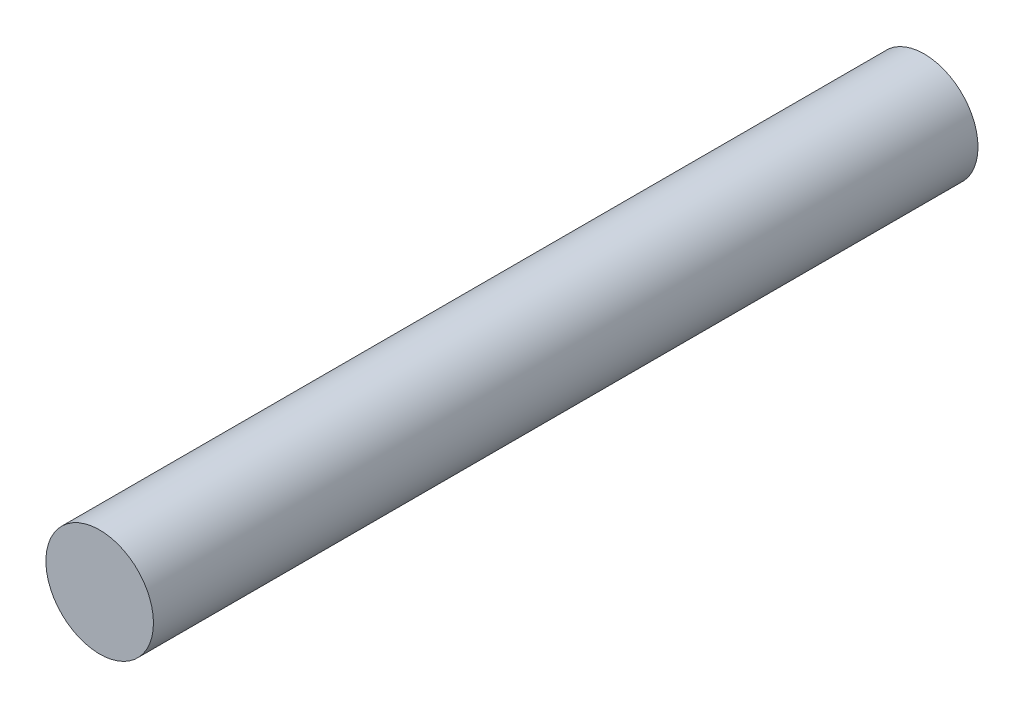
ISO-10303-21;
HEADER;
FILE_DESCRIPTION(('STEP AP214'),'2;1');
FILE_NAME('part.step','',(''),(''),'','','');
FILE_SCHEMA(('AUTOMOTIVE_DESIGN { 1 0 10303 214 1 1 1 1 }'));
ENDSEC;
DATA;
#1=APPLICATION_CONTEXT('core data for automotive mechanical design processes');
#2=APPLICATION_PROTOCOL_DEFINITION('international standard','automotive_design',2000,#1);
#3=PRODUCT_CONTEXT('',#1,'mechanical');
#4=PRODUCT('Part','Part','',(#3));
#5=PRODUCT_RELATED_PRODUCT_CATEGORY('part','',(#4));
#6=PRODUCT_DEFINITION_FORMATION('','',#4);
#7=PRODUCT_DEFINITION_CONTEXT('part definition',#1,'design');
#8=PRODUCT_DEFINITION('design','',#6,#7);
#9=PRODUCT_DEFINITION_SHAPE('','',#8);
#10=(LENGTH_UNIT() NAMED_UNIT(*) SI_UNIT(.MILLI.,.METRE.));
#11=(NAMED_UNIT(*) PLANE_ANGLE_UNIT() SI_UNIT($,.RADIAN.));
#12=(NAMED_UNIT(*) SI_UNIT($,.STERADIAN.) SOLID_ANGLE_UNIT());
#13=UNCERTAINTY_MEASURE_WITH_UNIT(LENGTH_MEASURE(1.E-05),#10,'distance_accuracy_value','');
#14=(GEOMETRIC_REPRESENTATION_CONTEXT(3) GLOBAL_UNCERTAINTY_ASSIGNED_CONTEXT((#13)) GLOBAL_UNIT_ASSIGNED_CONTEXT((#10,
#11,#12)) REPRESENTATION_CONTEXT('',''));
#15=CARTESIAN_POINT('',(0.,0.,0.));
#16=DIRECTION('',(0.,0.,1.));
#17=DIRECTION('',(1.,0.,0.));
#18=AXIS2_PLACEMENT_3D('',#15,#16,#17);
#19=CARTESIAN_POINT('',(-46.,0.,-23.));
#20=DIRECTION('',(0.,0.,-1.));
#21=DIRECTION('',(-1.,0.,0.));
#22=AXIS2_PLACEMENT_3D('',#19,#20,#21);
#23=PLANE('',#22);
#24=CARTESIAN_POINT('',(-46.,0.,-23.));
#25=DIRECTION('',(0.,0.,-1.));
#26=DIRECTION('',(-1.,0.,0.));
#27=AXIS2_PLACEMENT_3D('',#24,#25,#26);
#28=CIRCLE('',#27,1.5);
#29=CARTESIAN_POINT('',(-47.5,0.,-23.));
#30=VERTEX_POINT('',#29);
#31=EDGE_CURVE('E10',#30,#30,#28,.F.);
#32=ORIENTED_EDGE('',*,*,#31,.F.);
#33=EDGE_LOOP('',(#32));
#34=FACE_BOUND('',#33,.T.);
#35=ADVANCED_FACE('F36',(#34),#23,.T.);
#36=CARTESIAN_POINT('',(-46.,0.,0.));
#37=DIRECTION('',(0.,0.,1.));
#38=DIRECTION('',(1.,0.,0.));
#39=AXIS2_PLACEMENT_3D('',#36,#37,#38);
#40=PLANE('',#39);
#41=CARTESIAN_POINT('',(-46.,0.,0.));
#42=DIRECTION('',(0.,0.,1.));
#43=DIRECTION('',(1.,0.,0.));
#44=AXIS2_PLACEMENT_3D('',#41,#42,#43);
#45=CIRCLE('',#44,1.5);
#46=CARTESIAN_POINT('',(-44.5,0.,0.));
#47=VERTEX_POINT('',#46);
#48=EDGE_CURVE('E42',#47,#47,#45,.T.);
#49=ORIENTED_EDGE('',*,*,#48,.T.);
#50=EDGE_LOOP('',(#49));
#51=FACE_BOUND('',#50,.T.);
#52=ADVANCED_FACE('F48',(#51),#40,.T.);
#53=CARTESIAN_POINT('',(-46.,0.,-27.2426406871193));
#54=DIRECTION('',(0.,0.,1.));
#55=DIRECTION('',(1.,0.,0.));
#56=AXIS2_PLACEMENT_3D('',#53,#54,#55);
#57=CYLINDRICAL_SURFACE('',#56,1.5);
#58=ORIENTED_EDGE('',*,*,#48,.F.);
#59=EDGE_LOOP('',(#58));
#60=FACE_BOUND('',#59,.T.);
#61=ORIENTED_EDGE('',*,*,#31,.T.);
#62=EDGE_LOOP('',(#61));
#63=FACE_BOUND('',#62,.T.);
#64=ADVANCED_FACE('F50',(#60,#63),#57,.T.);
#65=CLOSED_SHELL('',(#35,#52,#64));
#66=MANIFOLD_SOLID_BREP('B2',#65);
#67=ADVANCED_BREP_SHAPE_REPRESENTATION('',(#18,#66),#14);
#68=SHAPE_DEFINITION_REPRESENTATION(#9,#67);
ENDSEC;
END-ISO-10303-21;
